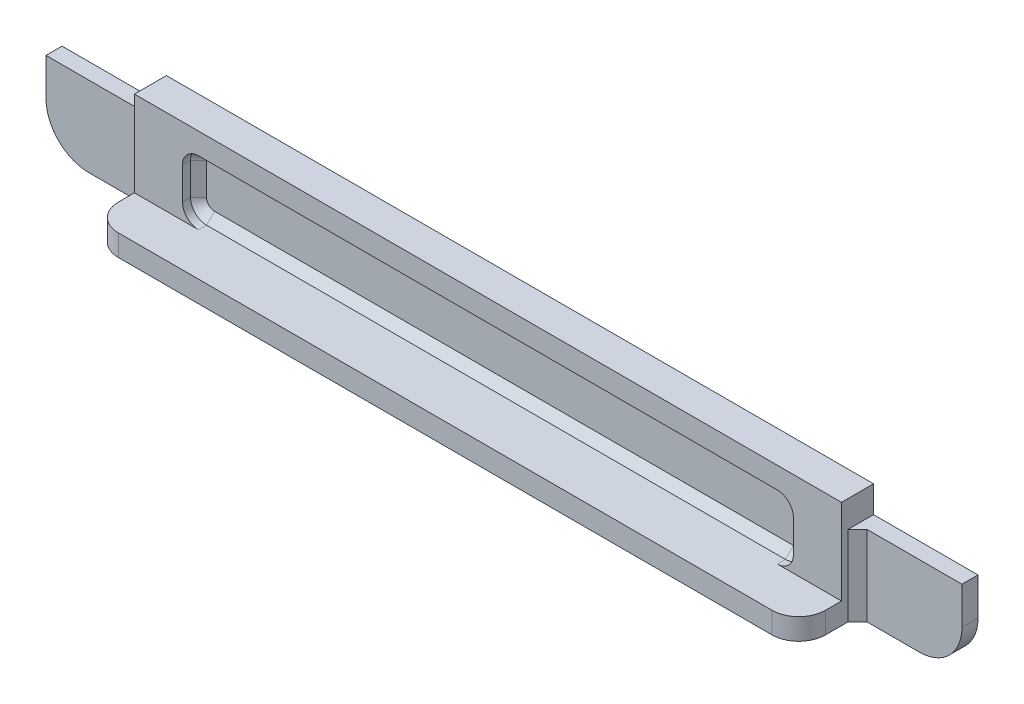
ISO-10303-21;
HEADER;
FILE_DESCRIPTION(('STEP AP214'),'2;1');
FILE_NAME('part.step','',(''),(''),'','','');
FILE_SCHEMA(('AUTOMOTIVE_DESIGN { 1 0 10303 214 1 1 1 1 }'));
ENDSEC;
DATA;
#1=APPLICATION_CONTEXT('core data for automotive mechanical design processes');
#2=APPLICATION_PROTOCOL_DEFINITION('international standard','automotive_design',2000,#1);
#3=PRODUCT_CONTEXT('',#1,'mechanical');
#4=PRODUCT('Part','Part','',(#3));
#5=PRODUCT_RELATED_PRODUCT_CATEGORY('part','',(#4));
#6=PRODUCT_DEFINITION_FORMATION('','',#4);
#7=PRODUCT_DEFINITION_CONTEXT('part definition',#1,'design');
#8=PRODUCT_DEFINITION('design','',#6,#7);
#9=PRODUCT_DEFINITION_SHAPE('','',#8);
#10=(LENGTH_UNIT() NAMED_UNIT(*) SI_UNIT(.MILLI.,.METRE.));
#11=(NAMED_UNIT(*) PLANE_ANGLE_UNIT() SI_UNIT($,.RADIAN.));
#12=(NAMED_UNIT(*) SI_UNIT($,.STERADIAN.) SOLID_ANGLE_UNIT());
#13=UNCERTAINTY_MEASURE_WITH_UNIT(LENGTH_MEASURE(1.E-05),#10,'distance_accuracy_value','');
#14=(GEOMETRIC_REPRESENTATION_CONTEXT(3) GLOBAL_UNCERTAINTY_ASSIGNED_CONTEXT((#13)) GLOBAL_UNIT_ASSIGNED_CONTEXT((#10,
#11,#12)) REPRESENTATION_CONTEXT('',''));
#15=CARTESIAN_POINT('',(0.,0.,0.));
#16=DIRECTION('',(0.,0.,1.));
#17=DIRECTION('',(1.,0.,0.));
#18=AXIS2_PLACEMENT_3D('',#15,#16,#17);
#19=CARTESIAN_POINT('',(85.725,10.,6.));
#20=DIRECTION('',(-1.,0.,0.));
#21=DIRECTION('',(0.,0.,1.));
#22=AXIS2_PLACEMENT_3D('',#19,#20,#21);
#23=PLANE('',#22);
#24=DIRECTION('',(0.,1.,0.));
#25=VECTOR('',#24,1.);
#26=CARTESIAN_POINT('',(85.725,-10.,3.));
#27=LINE('',#26,#25);
#28=CARTESIAN_POINT('',(85.725,-2.,3.));
#29=VERTEX_POINT('',#28);
#30=CARTESIAN_POINT('',(85.725,5.,3.));
#31=VERTEX_POINT('',#30);
#32=EDGE_CURVE('E328',#29,#31,#27,.T.);
#33=ORIENTED_EDGE('',*,*,#32,.F.);
#34=DIRECTION('',(0.,0.,-1.));
#35=VECTOR('',#34,1.);
#36=CARTESIAN_POINT('',(85.725,-2.,6.));
#37=LINE('',#36,#35);
#38=CARTESIAN_POINT('',(85.725,-2.,0.));
#39=VERTEX_POINT('',#38);
#40=EDGE_CURVE('E418',#29,#39,#37,.T.);
#41=ORIENTED_EDGE('',*,*,#40,.T.);
#42=DIRECTION('',(0.,1.,0.));
#43=VECTOR('',#42,1.);
#44=CARTESIAN_POINT('',(85.725,10.,0.));
#45=LINE('',#44,#43);
#46=CARTESIAN_POINT('',(85.725,5.,0.));
#47=VERTEX_POINT('',#46);
#48=EDGE_CURVE('E351',#39,#47,#45,.T.);
#49=ORIENTED_EDGE('',*,*,#48,.T.);
#50=DIRECTION('',(0.,0.,1.));
#51=VECTOR('',#50,1.);
#52=CARTESIAN_POINT('',(85.725,5.,-7.));
#53=LINE('',#52,#51);
#54=EDGE_CURVE('E300',#47,#31,#53,.T.);
#55=ORIENTED_EDGE('',*,*,#54,.T.);
#56=EDGE_LOOP('',(#33,#41,#49,#55));
#57=FACE_BOUND('',#56,.T.);
#58=ADVANCED_FACE('F33',(#57),#23,.F.);
#59=CARTESIAN_POINT('',(-85.725,10.,6.));
#60=DIRECTION('',(0.,-1.,0.));
#61=DIRECTION('',(0.,0.,-1.));
#62=AXIS2_PLACEMENT_3D('',#59,#60,#61);
#63=PLANE('',#62);
#64=DIRECTION('',(-1.,0.,0.));
#65=VECTOR('',#64,1.);
#66=CARTESIAN_POINT('',(-85.725,10.,6.));
#67=LINE('',#66,#65);
#68=CARTESIAN_POINT('',(66.175,10.,6.));
#69=VERTEX_POINT('',#68);
#70=CARTESIAN_POINT('',(-66.175,10.,6.));
#71=VERTEX_POINT('',#70);
#72=EDGE_CURVE('E352',#69,#71,#67,.T.);
#73=ORIENTED_EDGE('',*,*,#72,.F.);
#74=DIRECTION('',(0.,0.,1.));
#75=VECTOR('',#74,1.);
#76=CARTESIAN_POINT('',(66.175,10.,-7.));
#77=LINE('',#76,#75);
#78=CARTESIAN_POINT('',(66.175,10.,0.));
#79=VERTEX_POINT('',#78);
#80=EDGE_CURVE('E299',#79,#69,#77,.T.);
#81=ORIENTED_EDGE('',*,*,#80,.F.);
#82=DIRECTION('',(-1.,0.,0.));
#83=VECTOR('',#82,1.);
#84=CARTESIAN_POINT('',(-85.725,10.,0.));
#85=LINE('',#84,#83);
#86=CARTESIAN_POINT('',(-66.175,10.,0.));
#87=VERTEX_POINT('',#86);
#88=EDGE_CURVE('E358',#79,#87,#85,.T.);
#89=ORIENTED_EDGE('',*,*,#88,.T.);
#90=DIRECTION('',(0.,0.,1.));
#91=VECTOR('',#90,1.);
#92=CARTESIAN_POINT('',(-66.175,10.,-7.));
#93=LINE('',#92,#91);
#94=EDGE_CURVE('E314',#87,#71,#93,.T.);
#95=ORIENTED_EDGE('',*,*,#94,.T.);
#96=EDGE_LOOP('',(#73,#81,#89,#95));
#97=FACE_BOUND('',#96,.T.);
#98=ADVANCED_FACE('F596',(#97),#63,.F.);
#99=CARTESIAN_POINT('',(-85.725,10.,6.));
#100=DIRECTION('',(1.,0.,0.));
#101=DIRECTION('',(0.,0.,-1.));
#102=AXIS2_PLACEMENT_3D('',#99,#100,#101);
#103=PLANE('',#102);
#104=DIRECTION('',(0.,-1.,0.));
#105=VECTOR('',#104,1.);
#106=CARTESIAN_POINT('',(-85.725,10.,0.));
#107=LINE('',#106,#105);
#108=CARTESIAN_POINT('',(-85.725,5.,0.));
#109=VERTEX_POINT('',#108);
#110=CARTESIAN_POINT('',(-85.725,-2.,0.));
#111=VERTEX_POINT('',#110);
#112=EDGE_CURVE('E360',#109,#111,#107,.T.);
#113=ORIENTED_EDGE('',*,*,#112,.T.);
#114=DIRECTION('',(0.,0.,-1.));
#115=VECTOR('',#114,1.);
#116=CARTESIAN_POINT('',(-85.725,-2.,6.));
#117=LINE('',#116,#115);
#118=CARTESIAN_POINT('',(-85.725,-2.,3.));
#119=VERTEX_POINT('',#118);
#120=EDGE_CURVE('E453',#111,#119,#117,.F.);
#121=ORIENTED_EDGE('',*,*,#120,.T.);
#122=DIRECTION('',(0.,-1.,0.));
#123=VECTOR('',#122,1.);
#124=CARTESIAN_POINT('',(-85.725,-10.,3.));
#125=LINE('',#124,#123);
#126=CARTESIAN_POINT('',(-85.725,5.,3.));
#127=VERTEX_POINT('',#126);
#128=EDGE_CURVE('E341',#127,#119,#125,.T.);
#129=ORIENTED_EDGE('',*,*,#128,.F.);
#130=DIRECTION('',(0.,0.,1.));
#131=VECTOR('',#130,1.);
#132=CARTESIAN_POINT('',(-85.725,5.,-7.));
#133=LINE('',#132,#131);
#134=EDGE_CURVE('E313',#109,#127,#133,.T.);
#135=ORIENTED_EDGE('',*,*,#134,.F.);
#136=EDGE_LOOP('',(#113,#121,#129,#135));
#137=FACE_BOUND('',#136,.T.);
#138=ADVANCED_FACE('F563',(#137),#103,.F.);
#139=CARTESIAN_POINT('',(-85.725,-10.,6.));
#140=DIRECTION('',(0.,1.,0.));
#141=DIRECTION('',(0.,0.,1.));
#142=AXIS2_PLACEMENT_3D('',#139,#140,#141);
#143=PLANE('',#142);
#144=DIRECTION('',(0.,0.,1.));
#145=VECTOR('',#144,1.);
#146=CARTESIAN_POINT('',(66.175,-10.,3.));
#147=LINE('',#146,#145);
#148=CARTESIAN_POINT('',(66.175,-10.,4.80000000000001));
#149=VERTEX_POINT('',#148);
#150=CARTESIAN_POINT('',(66.175,-10.,9.));
#151=VERTEX_POINT('',#150);
#152=EDGE_CURVE('E336',#149,#151,#147,.T.);
#153=ORIENTED_EDGE('',*,*,#152,.T.);
#154=CARTESIAN_POINT('',(61.175,-10.,9.));
#155=DIRECTION('',(0.,1.,0.));
#156=DIRECTION('',(0.,0.,1.));
#157=AXIS2_PLACEMENT_3D('',#154,#155,#156);
#158=CIRCLE('',#157,5.);
#159=CARTESIAN_POINT('',(61.175,-10.,14.));
#160=VERTEX_POINT('',#159);
#161=EDGE_CURVE('E41',#151,#160,#158,.F.);
#162=ORIENTED_EDGE('',*,*,#161,.T.);
#163=DIRECTION('',(1.,0.,0.));
#164=VECTOR('',#163,1.);
#165=CARTESIAN_POINT('',(-66.175,-10.,14.));
#166=LINE('',#165,#164);
#167=CARTESIAN_POINT('',(-61.175,-10.,14.));
#168=VERTEX_POINT('',#167);
#169=EDGE_CURVE('E287',#168,#160,#166,.T.);
#170=ORIENTED_EDGE('',*,*,#169,.F.);
#171=CARTESIAN_POINT('',(-61.175,-10.,9.));
#172=DIRECTION('',(0.,1.,0.));
#173=DIRECTION('',(0.,0.,1.));
#174=AXIS2_PLACEMENT_3D('',#171,#172,#173);
#175=CIRCLE('',#174,5.);
#176=CARTESIAN_POINT('',(-66.175,-10.,9.));
#177=VERTEX_POINT('',#176);
#178=EDGE_CURVE('E48',#168,#177,#175,.F.);
#179=ORIENTED_EDGE('',*,*,#178,.T.);
#180=DIRECTION('',(0.,0.,1.));
#181=VECTOR('',#180,1.);
#182=CARTESIAN_POINT('',(-66.175,-10.,3.));
#183=LINE('',#182,#181);
#184=CARTESIAN_POINT('',(-66.175,-10.,4.80000000000001));
#185=VERTEX_POINT('',#184);
#186=EDGE_CURVE('E348',#185,#177,#183,.T.);
#187=ORIENTED_EDGE('',*,*,#186,.F.);
#188=DIRECTION('',(0.70710678118655,0.,0.707106781186545));
#189=VECTOR('',#188,1.);
#190=CARTESIAN_POINT('',(-75.3500000000001,-10.,-4.375));
#191=LINE('',#190,#189);
#192=CARTESIAN_POINT('',(-67.975,-10.,3.));
#193=VERTEX_POINT('',#192);
#194=EDGE_CURVE('E382',#185,#193,#191,.F.);
#195=ORIENTED_EDGE('',*,*,#194,.T.);
#196=DIRECTION('',(1.,0.,0.));
#197=VECTOR('',#196,1.);
#198=CARTESIAN_POINT('',(-85.725,-10.,3.));
#199=LINE('',#198,#197);
#200=CARTESIAN_POINT('',(-77.725,-10.,3.));
#201=VERTEX_POINT('',#200);
#202=EDGE_CURVE('E344',#201,#193,#199,.T.);
#203=ORIENTED_EDGE('',*,*,#202,.F.);
#204=DIRECTION('',(0.,0.,-1.));
#205=VECTOR('',#204,1.);
#206=CARTESIAN_POINT('',(-77.725,-10.,6.));
#207=LINE('',#206,#205);
#208=CARTESIAN_POINT('',(-77.725,-10.,0.));
#209=VERTEX_POINT('',#208);
#210=EDGE_CURVE('E446',#201,#209,#207,.T.);
#211=ORIENTED_EDGE('',*,*,#210,.T.);
#212=DIRECTION('',(1.,0.,0.));
#213=VECTOR('',#212,1.);
#214=CARTESIAN_POINT('',(-85.725,-10.,0.));
#215=LINE('',#214,#213);
#216=CARTESIAN_POINT('',(77.725,-10.,0.));
#217=VERTEX_POINT('',#216);
#218=EDGE_CURVE('E356',#209,#217,#215,.T.);
#219=ORIENTED_EDGE('',*,*,#218,.T.);
#220=DIRECTION('',(0.,0.,-1.));
#221=VECTOR('',#220,1.);
#222=CARTESIAN_POINT('',(77.725,-10.,6.));
#223=LINE('',#222,#221);
#224=CARTESIAN_POINT('',(77.725,-10.,3.));
#225=VERTEX_POINT('',#224);
#226=EDGE_CURVE('E449',#217,#225,#223,.F.);
#227=ORIENTED_EDGE('',*,*,#226,.T.);
#228=DIRECTION('',(1.,0.,0.));
#229=VECTOR('',#228,1.);
#230=CARTESIAN_POINT('',(85.725,-10.,3.));
#231=LINE('',#230,#229);
#232=CARTESIAN_POINT('',(67.975,-10.,3.));
#233=VERTEX_POINT('',#232);
#234=EDGE_CURVE('E333',#233,#225,#231,.T.);
#235=ORIENTED_EDGE('',*,*,#234,.F.);
#236=DIRECTION('',(-0.70710678118655,0.,0.707106781186545));
#237=VECTOR('',#236,1.);
#238=CARTESIAN_POINT('',(-10.3750000000006,-10.,81.35));
#239=LINE('',#238,#237);
#240=EDGE_CURVE('E375',#233,#149,#239,.T.);
#241=ORIENTED_EDGE('',*,*,#240,.T.);
#242=EDGE_LOOP('',(#153,#162,#170,#179,#187,#195,#203,#211,#219,#227,#235,#241));
#243=FACE_BOUND('',#242,.T.);
#244=ADVANCED_FACE('F469',(#243),#143,.F.);
#245=CARTESIAN_POINT('',(0.,0.,6.));
#246=DIRECTION('',(0.,0.,1.));
#247=DIRECTION('',(1.,0.,0.));
#248=AXIS2_PLACEMENT_3D('',#245,#246,#247);
#249=PLANE('',#248);
#250=CARTESIAN_POINT('',(54.175,-3.,6.));
#251=DIRECTION('',(0.,0.,1.));
#252=DIRECTION('',(1.,0.,0.));
#253=AXIS2_PLACEMENT_3D('',#250,#251,#252);
#254=CIRCLE('',#253,3.);
#255=CARTESIAN_POINT('',(54.175,-6.,6.));
#256=VERTEX_POINT('',#255);
#257=CARTESIAN_POINT('',(57.175,-2.99999999999998,6.));
#258=VERTEX_POINT('',#257);
#259=EDGE_CURVE('E247',#256,#258,#254,.T.);
#260=ORIENTED_EDGE('',*,*,#259,.F.);
#261=DIRECTION('',(-1.,0.,0.));
#262=VECTOR('',#261,1.);
#263=CARTESIAN_POINT('',(-66.175,-6.,6.));
#264=LINE('',#263,#262);
#265=CARTESIAN_POINT('',(66.175,-6.,6.));
#266=VERTEX_POINT('',#265);
#267=EDGE_CURVE('E291',#266,#256,#264,.T.);
#268=ORIENTED_EDGE('',*,*,#267,.F.);
#269=DIRECTION('',(0.,-1.,0.));
#270=VECTOR('',#269,1.);
#271=CARTESIAN_POINT('',(66.175,-10.,6.));
#272=LINE('',#271,#270);
#273=EDGE_CURVE('E327',#69,#266,#272,.T.);
#274=ORIENTED_EDGE('',*,*,#273,.F.);
#275=ORIENTED_EDGE('',*,*,#72,.T.);
#276=DIRECTION('',(0.,1.,0.));
#277=VECTOR('',#276,1.);
#278=CARTESIAN_POINT('',(-66.175,-10.,6.));
#279=LINE('',#278,#277);
#280=CARTESIAN_POINT('',(-66.175,-6.,6.));
#281=VERTEX_POINT('',#280);
#282=EDGE_CURVE('E340',#281,#71,#279,.T.);
#283=ORIENTED_EDGE('',*,*,#282,.F.);
#284=CARTESIAN_POINT('',(-54.175,-6.,6.));
#285=VERTEX_POINT('',#284);
#286=EDGE_CURVE('E275',#285,#281,#264,.T.);
#287=ORIENTED_EDGE('',*,*,#286,.F.);
#288=CARTESIAN_POINT('',(-54.175,-3.,6.));
#289=DIRECTION('',(0.,0.,1.));
#290=DIRECTION('',(-1.,0.,0.));
#291=AXIS2_PLACEMENT_3D('',#288,#289,#290);
#292=CIRCLE('',#291,3.);
#293=CARTESIAN_POINT('',(-57.175,-3.,6.));
#294=VERTEX_POINT('',#293);
#295=EDGE_CURVE('E244',#294,#285,#292,.T.);
#296=ORIENTED_EDGE('',*,*,#295,.F.);
#297=DIRECTION('',(0.,-1.,0.));
#298=VECTOR('',#297,1.);
#299=CARTESIAN_POINT('',(-57.175,-2.99999999999998,6.));
#300=LINE('',#299,#298);
#301=CARTESIAN_POINT('',(-57.175,2.99999999999998,6.));
#302=VERTEX_POINT('',#301);
#303=EDGE_CURVE('E269',#302,#294,#300,.T.);
#304=ORIENTED_EDGE('',*,*,#303,.F.);
#305=CARTESIAN_POINT('',(-54.175,3.,6.));
#306=DIRECTION('',(0.,0.,1.));
#307=DIRECTION('',(-1.,0.,0.));
#308=AXIS2_PLACEMENT_3D('',#305,#306,#307);
#309=CIRCLE('',#308,3.);
#310=CARTESIAN_POINT('',(-54.175,6.,6.));
#311=VERTEX_POINT('',#310);
#312=EDGE_CURVE('E266',#311,#302,#309,.T.);
#313=ORIENTED_EDGE('',*,*,#312,.F.);
#314=DIRECTION('',(-1.,0.,0.));
#315=VECTOR('',#314,1.);
#316=CARTESIAN_POINT('',(-54.175,6.,6.));
#317=LINE('',#316,#315);
#318=CARTESIAN_POINT('',(54.175,6.,6.));
#319=VERTEX_POINT('',#318);
#320=EDGE_CURVE('E261',#319,#311,#317,.T.);
#321=ORIENTED_EDGE('',*,*,#320,.F.);
#322=CARTESIAN_POINT('',(54.175,3.,6.));
#323=DIRECTION('',(0.,0.,1.));
#324=DIRECTION('',(-1.,0.,0.));
#325=AXIS2_PLACEMENT_3D('',#322,#323,#324);
#326=CIRCLE('',#325,3.);
#327=CARTESIAN_POINT('',(57.175,2.99999999999998,6.));
#328=VERTEX_POINT('',#327);
#329=EDGE_CURVE('E259',#328,#319,#326,.T.);
#330=ORIENTED_EDGE('',*,*,#329,.F.);
#331=DIRECTION('',(0.,1.,0.));
#332=VECTOR('',#331,1.);
#333=CARTESIAN_POINT('',(57.175,-2.99999999999998,6.));
#334=LINE('',#333,#332);
#335=EDGE_CURVE('E237',#258,#328,#334,.T.);
#336=ORIENTED_EDGE('',*,*,#335,.F.);
#337=EDGE_LOOP('',(#260,#268,#274,#275,#283,#287,#296,#304,#313,#321,#330,#336));
#338=FACE_BOUND('',#337,.T.);
#339=ADVANCED_FACE('F256',(#338),#249,.T.);
#340=CARTESIAN_POINT('',(0.,0.,0.));
#341=DIRECTION('',(0.,0.,1.));
#342=DIRECTION('',(1.,0.,0.));
#343=AXIS2_PLACEMENT_3D('',#340,#341,#342);
#344=PLANE('',#343);
#345=ORIENTED_EDGE('',*,*,#48,.F.);
#346=CARTESIAN_POINT('',(77.725,-2.,0.));
#347=DIRECTION('',(0.,0.,1.));
#348=DIRECTION('',(1.,0.,0.));
#349=AXIS2_PLACEMENT_3D('',#346,#347,#348);
#350=CIRCLE('',#349,8.);
#351=EDGE_CURVE('E444',#39,#217,#350,.F.);
#352=ORIENTED_EDGE('',*,*,#351,.T.);
#353=ORIENTED_EDGE('',*,*,#218,.F.);
#354=CARTESIAN_POINT('',(-77.725,-2.,0.));
#355=DIRECTION('',(0.,0.,1.));
#356=DIRECTION('',(1.,0.,0.));
#357=AXIS2_PLACEMENT_3D('',#354,#355,#356);
#358=CIRCLE('',#357,8.);
#359=EDGE_CURVE('E442',#209,#111,#358,.F.);
#360=ORIENTED_EDGE('',*,*,#359,.T.);
#361=ORIENTED_EDGE('',*,*,#112,.F.);
#362=DIRECTION('',(1.,0.,0.));
#363=VECTOR('',#362,1.);
#364=CARTESIAN_POINT('',(0.,5.,0.));
#365=LINE('',#364,#363);
#366=CARTESIAN_POINT('',(-66.175,5.,0.));
#367=VERTEX_POINT('',#366);
#368=EDGE_CURVE('E317',#109,#367,#365,.T.);
#369=ORIENTED_EDGE('',*,*,#368,.T.);
#370=DIRECTION('',(0.,1.,0.));
#371=VECTOR('',#370,1.);
#372=CARTESIAN_POINT('',(-66.175,0.,0.));
#373=LINE('',#372,#371);
#374=EDGE_CURVE('E324',#367,#87,#373,.T.);
#375=ORIENTED_EDGE('',*,*,#374,.T.);
#376=ORIENTED_EDGE('',*,*,#88,.F.);
#377=DIRECTION('',(0.,-1.,0.));
#378=VECTOR('',#377,1.);
#379=CARTESIAN_POINT('',(66.175,0.,0.));
#380=LINE('',#379,#378);
#381=CARTESIAN_POINT('',(66.175,5.,0.));
#382=VERTEX_POINT('',#381);
#383=EDGE_CURVE('E310',#79,#382,#380,.T.);
#384=ORIENTED_EDGE('',*,*,#383,.T.);
#385=DIRECTION('',(1.,0.,0.));
#386=VECTOR('',#385,1.);
#387=CARTESIAN_POINT('',(0.,5.,0.));
#388=LINE('',#387,#386);
#389=EDGE_CURVE('E303',#382,#47,#388,.T.);
#390=ORIENTED_EDGE('',*,*,#389,.T.);
#391=EDGE_LOOP('',(#345,#352,#353,#360,#361,#369,#375,#376,#384,#390));
#392=FACE_BOUND('',#391,.T.);
#393=ADVANCED_FACE('F573',(#392),#344,.F.);
#394=CARTESIAN_POINT('',(-66.175,-10.,3.));
#395=DIRECTION('',(1.,0.,0.));
#396=DIRECTION('',(0.,0.,-1.));
#397=AXIS2_PLACEMENT_3D('',#394,#395,#396);
#398=PLANE('',#397);
#399=ORIENTED_EDGE('',*,*,#186,.T.);
#400=DIRECTION('',(0.,-1.,0.));
#401=VECTOR('',#400,1.);
#402=CARTESIAN_POINT('',(-66.175,-10.,9.));
#403=LINE('',#402,#401);
#404=CARTESIAN_POINT('',(-66.175,-6.,9.));
#405=VERTEX_POINT('',#404);
#406=EDGE_CURVE('E11',#177,#405,#403,.F.);
#407=ORIENTED_EDGE('',*,*,#406,.T.);
#408=DIRECTION('',(0.,0.,-1.));
#409=VECTOR('',#408,1.);
#410=CARTESIAN_POINT('',(-66.175,-6.,14.));
#411=LINE('',#410,#409);
#412=EDGE_CURVE('E294',#405,#281,#411,.T.);
#413=ORIENTED_EDGE('',*,*,#412,.T.);
#414=ORIENTED_EDGE('',*,*,#282,.T.);
#415=ORIENTED_EDGE('',*,*,#94,.F.);
#416=ORIENTED_EDGE('',*,*,#374,.F.);
#417=DIRECTION('',(0.,0.,1.));
#418=VECTOR('',#417,1.);
#419=CARTESIAN_POINT('',(-66.175,5.,-7.));
#420=LINE('',#419,#418);
#421=CARTESIAN_POINT('',(-66.175,5.,4.80000000000001));
#422=VERTEX_POINT('',#421);
#423=EDGE_CURVE('E318',#367,#422,#420,.T.);
#424=ORIENTED_EDGE('',*,*,#423,.T.);
#425=DIRECTION('',(0.,-1.,0.));
#426=VECTOR('',#425,1.);
#427=CARTESIAN_POINT('',(-66.175,-10.,4.80000000000001));
#428=LINE('',#427,#426);
#429=EDGE_CURVE('E373',#422,#185,#428,.T.);
#430=ORIENTED_EDGE('',*,*,#429,.T.);
#431=EDGE_LOOP('',(#399,#407,#413,#414,#415,#416,#424,#430));
#432=FACE_BOUND('',#431,.T.);
#433=ADVANCED_FACE('F546',(#432),#398,.F.);
#434=CARTESIAN_POINT('',(0.,0.,3.));
#435=DIRECTION('',(0.,0.,-1.));
#436=DIRECTION('',(-1.,0.,0.));
#437=AXIS2_PLACEMENT_3D('',#434,#435,#436);
#438=PLANE('',#437);
#439=ORIENTED_EDGE('',*,*,#128,.T.);
#440=CARTESIAN_POINT('',(-77.725,-2.,3.));
#441=DIRECTION('',(0.,0.,-1.));
#442=DIRECTION('',(-1.,0.,0.));
#443=AXIS2_PLACEMENT_3D('',#440,#441,#442);
#444=CIRCLE('',#443,8.);
#445=EDGE_CURVE('E455',#119,#201,#444,.F.);
#446=ORIENTED_EDGE('',*,*,#445,.T.);
#447=ORIENTED_EDGE('',*,*,#202,.T.);
#448=DIRECTION('',(0.,1.,0.));
#449=VECTOR('',#448,1.);
#450=CARTESIAN_POINT('',(-67.975,5.,3.));
#451=LINE('',#450,#449);
#452=CARTESIAN_POINT('',(-67.975,5.,3.));
#453=VERTEX_POINT('',#452);
#454=EDGE_CURVE('E370',#193,#453,#451,.T.);
#455=ORIENTED_EDGE('',*,*,#454,.T.);
#456=DIRECTION('',(-1.,0.,0.));
#457=VECTOR('',#456,1.);
#458=CARTESIAN_POINT('',(-85.725,5.,3.));
#459=LINE('',#458,#457);
#460=EDGE_CURVE('E346',#453,#127,#459,.T.);
#461=ORIENTED_EDGE('',*,*,#460,.T.);
#462=EDGE_LOOP('',(#439,#446,#447,#455,#461));
#463=FACE_BOUND('',#462,.T.);
#464=ADVANCED_FACE('F555',(#463),#438,.F.);
#465=CARTESIAN_POINT('',(66.175,-10.,3.));
#466=DIRECTION('',(-1.,0.,0.));
#467=DIRECTION('',(0.,0.,1.));
#468=AXIS2_PLACEMENT_3D('',#465,#466,#467);
#469=PLANE('',#468);
#470=DIRECTION('',(0.,0.,-1.));
#471=VECTOR('',#470,1.);
#472=CARTESIAN_POINT('',(66.175,-6.,14.));
#473=LINE('',#472,#471);
#474=CARTESIAN_POINT('',(66.175,-6.,9.));
#475=VERTEX_POINT('',#474);
#476=EDGE_CURVE('E297',#475,#266,#473,.T.);
#477=ORIENTED_EDGE('',*,*,#476,.F.);
#478=DIRECTION('',(0.,1.,0.));
#479=VECTOR('',#478,1.);
#480=CARTESIAN_POINT('',(66.175,-10.,9.));
#481=LINE('',#480,#479);
#482=EDGE_CURVE('E56',#475,#151,#481,.F.);
#483=ORIENTED_EDGE('',*,*,#482,.T.);
#484=ORIENTED_EDGE('',*,*,#152,.F.);
#485=DIRECTION('',(0.,1.,0.));
#486=VECTOR('',#485,1.);
#487=CARTESIAN_POINT('',(66.175,-10.,4.80000000000001));
#488=LINE('',#487,#486);
#489=CARTESIAN_POINT('',(66.175,5.,4.80000000000001));
#490=VERTEX_POINT('',#489);
#491=EDGE_CURVE('E367',#149,#490,#488,.T.);
#492=ORIENTED_EDGE('',*,*,#491,.T.);
#493=DIRECTION('',(0.,0.,1.));
#494=VECTOR('',#493,1.);
#495=CARTESIAN_POINT('',(66.175,5.,-7.));
#496=LINE('',#495,#494);
#497=EDGE_CURVE('E304',#382,#490,#496,.T.);
#498=ORIENTED_EDGE('',*,*,#497,.F.);
#499=ORIENTED_EDGE('',*,*,#383,.F.);
#500=ORIENTED_EDGE('',*,*,#80,.T.);
#501=ORIENTED_EDGE('',*,*,#273,.T.);
#502=EDGE_LOOP('',(#477,#483,#484,#492,#498,#499,#500,#501));
#503=FACE_BOUND('',#502,.T.);
#504=ADVANCED_FACE('F479',(#503),#469,.F.);
#505=CARTESIAN_POINT('',(0.,0.,3.));
#506=DIRECTION('',(0.,0.,1.));
#507=DIRECTION('',(1.,0.,0.));
#508=AXIS2_PLACEMENT_3D('',#505,#506,#507);
#509=PLANE('',#508);
#510=ORIENTED_EDGE('',*,*,#234,.T.);
#511=CARTESIAN_POINT('',(77.725,-2.,3.));
#512=DIRECTION('',(0.,0.,1.));
#513=DIRECTION('',(1.,0.,0.));
#514=AXIS2_PLACEMENT_3D('',#511,#512,#513);
#515=CIRCLE('',#514,8.);
#516=EDGE_CURVE('E451',#225,#29,#515,.T.);
#517=ORIENTED_EDGE('',*,*,#516,.T.);
#518=ORIENTED_EDGE('',*,*,#32,.T.);
#519=DIRECTION('',(-1.,0.,0.));
#520=VECTOR('',#519,1.);
#521=CARTESIAN_POINT('',(85.725,5.,3.));
#522=LINE('',#521,#520);
#523=CARTESIAN_POINT('',(67.975,5.,3.));
#524=VERTEX_POINT('',#523);
#525=EDGE_CURVE('E330',#31,#524,#522,.T.);
#526=ORIENTED_EDGE('',*,*,#525,.T.);
#527=DIRECTION('',(0.,-1.,0.));
#528=VECTOR('',#527,1.);
#529=CARTESIAN_POINT('',(67.975,0.,3.));
#530=LINE('',#529,#528);
#531=EDGE_CURVE('E355',#524,#233,#530,.T.);
#532=ORIENTED_EDGE('',*,*,#531,.T.);
#533=EDGE_LOOP('',(#510,#517,#518,#526,#532));
#534=FACE_BOUND('',#533,.T.);
#535=ADVANCED_FACE('F583',(#534),#509,.T.);
#536=CARTESIAN_POINT('',(-85.725,5.,-7.));
#537=DIRECTION('',(0.,-1.,0.));
#538=DIRECTION('',(0.,0.,-1.));
#539=AXIS2_PLACEMENT_3D('',#536,#537,#538);
#540=PLANE('',#539);
#541=ORIENTED_EDGE('',*,*,#134,.T.);
#542=ORIENTED_EDGE('',*,*,#460,.F.);
#543=DIRECTION('',(-0.70710678118655,0.,-0.707106781186545));
#544=VECTOR('',#543,1.);
#545=CARTESIAN_POINT('',(-81.8500000000001,5.,-10.8749999999999));
#546=LINE('',#545,#544);
#547=EDGE_CURVE('E379',#453,#422,#546,.F.);
#548=ORIENTED_EDGE('',*,*,#547,.T.);
#549=ORIENTED_EDGE('',*,*,#423,.F.);
#550=ORIENTED_EDGE('',*,*,#368,.F.);
#551=EDGE_LOOP('',(#541,#542,#548,#549,#550));
#552=FACE_BOUND('',#551,.T.);
#553=ADVANCED_FACE('F557',(#552),#540,.F.);
#554=CARTESIAN_POINT('',(85.725,5.,-7.));
#555=DIRECTION('',(0.,-1.,0.));
#556=DIRECTION('',(0.,0.,-1.));
#557=AXIS2_PLACEMENT_3D('',#554,#555,#556);
#558=PLANE('',#557);
#559=ORIENTED_EDGE('',*,*,#497,.T.);
#560=DIRECTION('',(0.70710678118655,0.,-0.707106781186545));
#561=VECTOR('',#560,1.);
#562=CARTESIAN_POINT('',(81.8500000000001,5.,-10.8749999999999));
#563=LINE('',#562,#561);
#564=EDGE_CURVE('E377',#490,#524,#563,.T.);
#565=ORIENTED_EDGE('',*,*,#564,.T.);
#566=ORIENTED_EDGE('',*,*,#525,.F.);
#567=ORIENTED_EDGE('',*,*,#54,.F.);
#568=ORIENTED_EDGE('',*,*,#389,.F.);
#569=EDGE_LOOP('',(#559,#565,#566,#567,#568));
#570=FACE_BOUND('',#569,.T.);
#571=ADVANCED_FACE('F586',(#570),#558,.F.);
#572=CARTESIAN_POINT('',(67.975,0.,3.));
#573=DIRECTION('',(-0.707106781186545,0.,-0.70710678118655));
#574=DIRECTION('',(0.,-1.,0.));
#575=AXIS2_PLACEMENT_3D('',#572,#573,#574);
#576=PLANE('',#575);
#577=ORIENTED_EDGE('',*,*,#564,.F.);
#578=ORIENTED_EDGE('',*,*,#491,.F.);
#579=ORIENTED_EDGE('',*,*,#240,.F.);
#580=ORIENTED_EDGE('',*,*,#531,.F.);
#581=EDGE_LOOP('',(#577,#578,#579,#580));
#582=FACE_BOUND('',#581,.T.);
#583=ADVANCED_FACE('F591',(#582),#576,.F.);
#584=CARTESIAN_POINT('',(-67.975,0.,3.));
#585=DIRECTION('',(-0.707106781186545,0.,0.70710678118655));
#586=DIRECTION('',(0.,-1.,0.));
#587=AXIS2_PLACEMENT_3D('',#584,#585,#586);
#588=PLANE('',#587);
#589=ORIENTED_EDGE('',*,*,#194,.F.);
#590=ORIENTED_EDGE('',*,*,#429,.F.);
#591=ORIENTED_EDGE('',*,*,#547,.F.);
#592=ORIENTED_EDGE('',*,*,#454,.F.);
#593=EDGE_LOOP('',(#589,#590,#591,#592));
#594=FACE_BOUND('',#593,.T.);
#595=ADVANCED_FACE('F552',(#594),#588,.T.);
#596=CARTESIAN_POINT('',(-66.175,-6.,14.));
#597=DIRECTION('',(0.,-1.,0.));
#598=DIRECTION('',(0.,0.,-1.));
#599=AXIS2_PLACEMENT_3D('',#596,#597,#598);
#600=PLANE('',#599);
#601=DIRECTION('',(-1.,0.,0.));
#602=VECTOR('',#601,1.);
#603=CARTESIAN_POINT('',(-66.175,-6.,14.));
#604=LINE('',#603,#602);
#605=CARTESIAN_POINT('',(61.175,-6.,14.));
#606=VERTEX_POINT('',#605);
#607=CARTESIAN_POINT('',(-61.175,-6.,14.));
#608=VERTEX_POINT('',#607);
#609=EDGE_CURVE('E290',#606,#608,#604,.T.);
#610=ORIENTED_EDGE('',*,*,#609,.F.);
#611=CARTESIAN_POINT('',(61.175,-6.,9.));
#612=DIRECTION('',(0.,-1.,0.));
#613=DIRECTION('',(0.,0.,-1.));
#614=AXIS2_PLACEMENT_3D('',#611,#612,#613);
#615=CIRCLE('',#614,5.);
#616=EDGE_CURVE('E465',#606,#475,#615,.F.);
#617=ORIENTED_EDGE('',*,*,#616,.T.);
#618=ORIENTED_EDGE('',*,*,#476,.T.);
#619=ORIENTED_EDGE('',*,*,#267,.T.);
#620=DIRECTION('',(0.,0.,1.));
#621=VECTOR('',#620,1.);
#622=CARTESIAN_POINT('',(54.175,-6.,3.));
#623=LINE('',#622,#621);
#624=CARTESIAN_POINT('',(54.175,-6.,4.49999999999999));
#625=VERTEX_POINT('',#624);
#626=EDGE_CURVE('E250',#625,#256,#623,.T.);
#627=ORIENTED_EDGE('',*,*,#626,.F.);
#628=DIRECTION('',(-1.,0.,0.));
#629=VECTOR('',#628,1.);
#630=CARTESIAN_POINT('',(-66.175,-6.,4.49999999999999));
#631=LINE('',#630,#629);
#632=CARTESIAN_POINT('',(-54.175,-6.,4.49999999999999));
#633=VERTEX_POINT('',#632);
#634=EDGE_CURVE('E402',#625,#633,#631,.T.);
#635=ORIENTED_EDGE('',*,*,#634,.T.);
#636=DIRECTION('',(0.,0.,1.));
#637=VECTOR('',#636,1.);
#638=CARTESIAN_POINT('',(-54.175,-6.,3.));
#639=LINE('',#638,#637);
#640=EDGE_CURVE('E276',#633,#285,#639,.T.);
#641=ORIENTED_EDGE('',*,*,#640,.T.);
#642=ORIENTED_EDGE('',*,*,#286,.T.);
#643=ORIENTED_EDGE('',*,*,#412,.F.);
#644=CARTESIAN_POINT('',(-61.175,-6.,9.));
#645=DIRECTION('',(0.,-1.,0.));
#646=DIRECTION('',(0.,0.,-1.));
#647=AXIS2_PLACEMENT_3D('',#644,#645,#646);
#648=CIRCLE('',#647,5.);
#649=EDGE_CURVE('E463',#405,#608,#648,.F.);
#650=ORIENTED_EDGE('',*,*,#649,.T.);
#651=EDGE_LOOP('',(#610,#617,#618,#619,#627,#635,#641,#642,#643,#650));
#652=FACE_BOUND('',#651,.T.);
#653=ADVANCED_FACE('F478',(#652),#600,.F.);
#654=CARTESIAN_POINT('',(0.,0.,14.));
#655=DIRECTION('',(0.,0.,-1.));
#656=DIRECTION('',(-1.,0.,0.));
#657=AXIS2_PLACEMENT_3D('',#654,#655,#656);
#658=PLANE('',#657);
#659=ORIENTED_EDGE('',*,*,#169,.T.);
#660=DIRECTION('',(0.,1.,0.));
#661=VECTOR('',#660,1.);
#662=CARTESIAN_POINT('',(61.175,0.,14.));
#663=LINE('',#662,#661);
#664=EDGE_CURVE('E460',#160,#606,#663,.T.);
#665=ORIENTED_EDGE('',*,*,#664,.T.);
#666=ORIENTED_EDGE('',*,*,#609,.T.);
#667=DIRECTION('',(0.,-1.,0.));
#668=VECTOR('',#667,1.);
#669=CARTESIAN_POINT('',(-61.175,0.,14.));
#670=LINE('',#669,#668);
#671=EDGE_CURVE('E457',#608,#168,#670,.T.);
#672=ORIENTED_EDGE('',*,*,#671,.T.);
#673=EDGE_LOOP('',(#659,#665,#666,#672));
#674=FACE_BOUND('',#673,.T.);
#675=ADVANCED_FACE('F473',(#674),#658,.F.);
#676=CARTESIAN_POINT('',(54.175,-3.,3.));
#677=DIRECTION('',(0.,0.,1.));
#678=DIRECTION('',(1.,0.,0.));
#679=AXIS2_PLACEMENT_3D('',#676,#677,#678);
#680=CYLINDRICAL_SURFACE('',#679,3.);
#681=DIRECTION('',(0.,0.,1.));
#682=VECTOR('',#681,1.);
#683=CARTESIAN_POINT('',(57.175,-2.99999999999998,3.));
#684=LINE('',#683,#682);
#685=CARTESIAN_POINT('',(57.175,-2.99999999999998,4.49999999999999));
#686=VERTEX_POINT('',#685);
#687=EDGE_CURVE('E232',#686,#258,#684,.T.);
#688=ORIENTED_EDGE('',*,*,#687,.F.);
#689=CARTESIAN_POINT('',(54.175,-3.,4.49999999999999));
#690=DIRECTION('',(0.,0.,1.));
#691=DIRECTION('',(1.,0.,0.));
#692=AXIS2_PLACEMENT_3D('',#689,#690,#691);
#693=CIRCLE('',#692,3.);
#694=EDGE_CURVE('E405',#686,#625,#693,.F.);
#695=ORIENTED_EDGE('',*,*,#694,.T.);
#696=ORIENTED_EDGE('',*,*,#626,.T.);
#697=ORIENTED_EDGE('',*,*,#259,.T.);
#698=EDGE_LOOP('',(#688,#695,#696,#697));
#699=FACE_BOUND('',#698,.T.);
#700=ADVANCED_FACE('F248',(#699),#680,.F.);
#701=CARTESIAN_POINT('',(-54.175,-3.,3.));
#702=DIRECTION('',(0.,0.,1.));
#703=DIRECTION('',(1.,0.,0.));
#704=AXIS2_PLACEMENT_3D('',#701,#702,#703);
#705=CYLINDRICAL_SURFACE('',#704,3.);
#706=ORIENTED_EDGE('',*,*,#640,.F.);
#707=CARTESIAN_POINT('',(-54.175,-3.,4.49999999999999));
#708=DIRECTION('',(0.,0.,1.));
#709=DIRECTION('',(1.,0.,0.));
#710=AXIS2_PLACEMENT_3D('',#707,#708,#709);
#711=CIRCLE('',#710,3.);
#712=CARTESIAN_POINT('',(-57.175,-3.,4.49999999999999));
#713=VERTEX_POINT('',#712);
#714=EDGE_CURVE('E407',#633,#713,#711,.F.);
#715=ORIENTED_EDGE('',*,*,#714,.T.);
#716=DIRECTION('',(0.,0.,1.));
#717=VECTOR('',#716,1.);
#718=CARTESIAN_POINT('',(-57.175,-3.,3.));
#719=LINE('',#718,#717);
#720=EDGE_CURVE('E278',#713,#294,#719,.T.);
#721=ORIENTED_EDGE('',*,*,#720,.T.);
#722=ORIENTED_EDGE('',*,*,#295,.T.);
#723=EDGE_LOOP('',(#706,#715,#721,#722));
#724=FACE_BOUND('',#723,.T.);
#725=ADVANCED_FACE('F505',(#724),#705,.F.);
#726=CARTESIAN_POINT('',(-57.175,-2.99999999999998,3.));
#727=DIRECTION('',(-1.,0.,0.));
#728=DIRECTION('',(0.,-1.,0.));
#729=AXIS2_PLACEMENT_3D('',#726,#727,#728);
#730=PLANE('',#729);
#731=ORIENTED_EDGE('',*,*,#720,.F.);
#732=DIRECTION('',(0.,1.,0.));
#733=VECTOR('',#732,1.);
#734=CARTESIAN_POINT('',(-57.175,-2.99999999999998,4.49999999999999));
#735=LINE('',#734,#733);
#736=CARTESIAN_POINT('',(-57.175,2.99999999999998,4.49999999999999));
#737=VERTEX_POINT('',#736);
#738=EDGE_CURVE('E410',#713,#737,#735,.T.);
#739=ORIENTED_EDGE('',*,*,#738,.T.);
#740=DIRECTION('',(0.,0.,1.));
#741=VECTOR('',#740,1.);
#742=CARTESIAN_POINT('',(-57.175,2.99999999999998,3.));
#743=LINE('',#742,#741);
#744=EDGE_CURVE('E280',#737,#302,#743,.T.);
#745=ORIENTED_EDGE('',*,*,#744,.T.);
#746=ORIENTED_EDGE('',*,*,#303,.T.);
#747=EDGE_LOOP('',(#731,#739,#745,#746));
#748=FACE_BOUND('',#747,.T.);
#749=ADVANCED_FACE('F508',(#748),#730,.F.);
#750=CARTESIAN_POINT('',(-54.175,3.,3.));
#751=DIRECTION('',(0.,0.,1.));
#752=DIRECTION('',(1.,0.,0.));
#753=AXIS2_PLACEMENT_3D('',#750,#751,#752);
#754=CYLINDRICAL_SURFACE('',#753,3.);
#755=ORIENTED_EDGE('',*,*,#744,.F.);
#756=CARTESIAN_POINT('',(-54.175,3.,4.49999999999999));
#757=DIRECTION('',(0.,0.,1.));
#758=DIRECTION('',(1.,0.,0.));
#759=AXIS2_PLACEMENT_3D('',#756,#757,#758);
#760=CIRCLE('',#759,3.);
#761=CARTESIAN_POINT('',(-54.175,6.,4.49999999999999));
#762=VERTEX_POINT('',#761);
#763=EDGE_CURVE('E414',#737,#762,#760,.F.);
#764=ORIENTED_EDGE('',*,*,#763,.T.);
#765=DIRECTION('',(0.,0.,1.));
#766=VECTOR('',#765,1.);
#767=CARTESIAN_POINT('',(-54.175,6.,3.));
#768=LINE('',#767,#766);
#769=EDGE_CURVE('E282',#762,#311,#768,.T.);
#770=ORIENTED_EDGE('',*,*,#769,.T.);
#771=ORIENTED_EDGE('',*,*,#312,.T.);
#772=EDGE_LOOP('',(#755,#764,#770,#771));
#773=FACE_BOUND('',#772,.T.);
#774=ADVANCED_FACE('F522',(#773),#754,.F.);
#775=CARTESIAN_POINT('',(-54.175,6.,3.));
#776=DIRECTION('',(0.,1.,0.));
#777=DIRECTION('',(0.,0.,1.));
#778=AXIS2_PLACEMENT_3D('',#775,#776,#777);
#779=PLANE('',#778);
#780=ORIENTED_EDGE('',*,*,#769,.F.);
#781=DIRECTION('',(1.,0.,0.));
#782=VECTOR('',#781,1.);
#783=CARTESIAN_POINT('',(-54.175,6.,4.49999999999999));
#784=LINE('',#783,#782);
#785=CARTESIAN_POINT('',(54.175,6.,4.49999999999999));
#786=VERTEX_POINT('',#785);
#787=EDGE_CURVE('E416',#762,#786,#784,.T.);
#788=ORIENTED_EDGE('',*,*,#787,.T.);
#789=DIRECTION('',(0.,0.,1.));
#790=VECTOR('',#789,1.);
#791=CARTESIAN_POINT('',(54.175,6.,3.));
#792=LINE('',#791,#790);
#793=EDGE_CURVE('E284',#786,#319,#792,.T.);
#794=ORIENTED_EDGE('',*,*,#793,.T.);
#795=ORIENTED_EDGE('',*,*,#320,.T.);
#796=EDGE_LOOP('',(#780,#788,#794,#795));
#797=FACE_BOUND('',#796,.T.);
#798=ADVANCED_FACE('F525',(#797),#779,.F.);
#799=CARTESIAN_POINT('',(54.175,3.,3.));
#800=DIRECTION('',(0.,0.,1.));
#801=DIRECTION('',(1.,0.,0.));
#802=AXIS2_PLACEMENT_3D('',#799,#800,#801);
#803=CYLINDRICAL_SURFACE('',#802,3.);
#804=ORIENTED_EDGE('',*,*,#793,.F.);
#805=CARTESIAN_POINT('',(54.175,3.,4.49999999999999));
#806=DIRECTION('',(0.,0.,1.));
#807=DIRECTION('',(1.,0.,0.));
#808=AXIS2_PLACEMENT_3D('',#805,#806,#807);
#809=CIRCLE('',#808,3.);
#810=CARTESIAN_POINT('',(57.175,2.99999999999998,4.49999999999999));
#811=VERTEX_POINT('',#810);
#812=EDGE_CURVE('E412',#786,#811,#809,.F.);
#813=ORIENTED_EDGE('',*,*,#812,.T.);
#814=DIRECTION('',(0.,0.,1.));
#815=VECTOR('',#814,1.);
#816=CARTESIAN_POINT('',(57.175,2.99999999999998,3.));
#817=LINE('',#816,#815);
#818=EDGE_CURVE('E243',#811,#328,#817,.T.);
#819=ORIENTED_EDGE('',*,*,#818,.T.);
#820=ORIENTED_EDGE('',*,*,#329,.T.);
#821=EDGE_LOOP('',(#804,#813,#819,#820));
#822=FACE_BOUND('',#821,.T.);
#823=ADVANCED_FACE('F538',(#822),#803,.F.);
#824=CARTESIAN_POINT('',(57.175,-2.99999999999998,3.));
#825=DIRECTION('',(1.,0.,0.));
#826=DIRECTION('',(0.,1.,0.));
#827=AXIS2_PLACEMENT_3D('',#824,#825,#826);
#828=PLANE('',#827);
#829=ORIENTED_EDGE('',*,*,#818,.F.);
#830=DIRECTION('',(0.,-1.,0.));
#831=VECTOR('',#830,1.);
#832=CARTESIAN_POINT('',(57.175,-2.99999999999998,4.49999999999999));
#833=LINE('',#832,#831);
#834=EDGE_CURVE('E240',#811,#686,#833,.T.);
#835=ORIENTED_EDGE('',*,*,#834,.T.);
#836=ORIENTED_EDGE('',*,*,#687,.T.);
#837=ORIENTED_EDGE('',*,*,#335,.T.);
#838=EDGE_LOOP('',(#829,#835,#836,#837));
#839=FACE_BOUND('',#838,.T.);
#840=ADVANCED_FACE('F235',(#839),#828,.F.);
#841=CARTESIAN_POINT('',(54.175,-3.,3.));
#842=DIRECTION('',(0.,0.,1.));
#843=DIRECTION('',(1.,0.,0.));
#844=AXIS2_PLACEMENT_3D('',#841,#842,#843);
#845=PLANE('',#844);
#846=CARTESIAN_POINT('',(-54.175,-3.,3.));
#847=DIRECTION('',(0.,0.,1.));
#848=DIRECTION('',(1.,0.,0.));
#849=AXIS2_PLACEMENT_3D('',#846,#847,#848);
#850=CIRCLE('',#849,1.49999999999999);
#851=CARTESIAN_POINT('',(-55.675,-3.,3.));
#852=VERTEX_POINT('',#851);
#853=CARTESIAN_POINT('',(-54.175,-4.49999999999999,3.));
#854=VERTEX_POINT('',#853);
#855=EDGE_CURVE('E395',#852,#854,#850,.T.);
#856=ORIENTED_EDGE('',*,*,#855,.T.);
#857=DIRECTION('',(1.,0.,0.));
#858=VECTOR('',#857,1.);
#859=CARTESIAN_POINT('',(54.175,-4.5,3.));
#860=LINE('',#859,#858);
#861=CARTESIAN_POINT('',(54.175,-4.49999999999999,3.));
#862=VERTEX_POINT('',#861);
#863=EDGE_CURVE('E399',#854,#862,#860,.T.);
#864=ORIENTED_EDGE('',*,*,#863,.T.);
#865=CARTESIAN_POINT('',(54.175,-3.,3.));
#866=DIRECTION('',(0.,0.,1.));
#867=DIRECTION('',(1.,0.,0.));
#868=AXIS2_PLACEMENT_3D('',#865,#866,#867);
#869=CIRCLE('',#868,1.49999999999999);
#870=CARTESIAN_POINT('',(55.675,-2.99999999999999,3.));
#871=VERTEX_POINT('',#870);
#872=EDGE_CURVE('E397',#862,#871,#869,.T.);
#873=ORIENTED_EDGE('',*,*,#872,.T.);
#874=DIRECTION('',(0.,1.,0.));
#875=VECTOR('',#874,1.);
#876=CARTESIAN_POINT('',(55.675,-3.,3.));
#877=LINE('',#876,#875);
#878=CARTESIAN_POINT('',(55.675,2.99999999999998,3.));
#879=VERTEX_POINT('',#878);
#880=EDGE_CURVE('E393',#871,#879,#877,.T.);
#881=ORIENTED_EDGE('',*,*,#880,.T.);
#882=CARTESIAN_POINT('',(54.175,3.,3.));
#883=DIRECTION('',(0.,0.,1.));
#884=DIRECTION('',(1.,0.,0.));
#885=AXIS2_PLACEMENT_3D('',#882,#883,#884);
#886=CIRCLE('',#885,1.5);
#887=CARTESIAN_POINT('',(54.175,4.5,3.));
#888=VERTEX_POINT('',#887);
#889=EDGE_CURVE('E389',#879,#888,#886,.T.);
#890=ORIENTED_EDGE('',*,*,#889,.T.);
#891=DIRECTION('',(-1.,0.,0.));
#892=VECTOR('',#891,1.);
#893=CARTESIAN_POINT('',(54.175,4.5,3.));
#894=LINE('',#893,#892);
#895=CARTESIAN_POINT('',(-54.175,4.5,3.));
#896=VERTEX_POINT('',#895);
#897=EDGE_CURVE('E385',#888,#896,#894,.T.);
#898=ORIENTED_EDGE('',*,*,#897,.T.);
#899=CARTESIAN_POINT('',(-54.175,3.,3.));
#900=DIRECTION('',(0.,0.,1.));
#901=DIRECTION('',(1.,0.,0.));
#902=AXIS2_PLACEMENT_3D('',#899,#900,#901);
#903=CIRCLE('',#902,1.5);
#904=CARTESIAN_POINT('',(-55.675,2.99999999999998,3.));
#905=VERTEX_POINT('',#904);
#906=EDGE_CURVE('E387',#896,#905,#903,.T.);
#907=ORIENTED_EDGE('',*,*,#906,.T.);
#908=DIRECTION('',(0.,-1.,0.));
#909=VECTOR('',#908,1.);
#910=CARTESIAN_POINT('',(-55.675,-3.00000000000013,3.));
#911=LINE('',#910,#909);
#912=EDGE_CURVE('E391',#905,#852,#911,.T.);
#913=ORIENTED_EDGE('',*,*,#912,.T.);
#914=EDGE_LOOP('',(#856,#864,#873,#881,#890,#898,#907,#913));
#915=FACE_BOUND('',#914,.T.);
#916=ADVANCED_FACE('F497',(#915),#845,.T.);
#917=CARTESIAN_POINT('',(54.175,4.5,3.));
#918=DIRECTION('',(0.,0.707106781186544,-0.707106781186551));
#919=DIRECTION('',(-1.,0.,0.));
#920=AXIS2_PLACEMENT_3D('',#917,#918,#919);
#921=PLANE('',#920);
#922=DIRECTION('',(0.,-0.707106781186551,-0.707106781186544));
#923=VECTOR('',#922,1.);
#924=CARTESIAN_POINT('',(54.175,6.,4.49999999999999));
#925=LINE('',#924,#923);
#926=EDGE_CURVE('E435',#786,#888,#925,.T.);
#927=ORIENTED_EDGE('',*,*,#926,.F.);
#928=ORIENTED_EDGE('',*,*,#787,.F.);
#929=DIRECTION('',(0.,0.707106781186551,0.707106781186544));
#930=VECTOR('',#929,1.);
#931=CARTESIAN_POINT('',(-54.175,4.5,3.));
#932=LINE('',#931,#930);
#933=EDGE_CURVE('E254',#896,#762,#932,.T.);
#934=ORIENTED_EDGE('',*,*,#933,.F.);
#935=ORIENTED_EDGE('',*,*,#897,.F.);
#936=EDGE_LOOP('',(#927,#928,#934,#935));
#937=FACE_BOUND('',#936,.T.);
#938=ADVANCED_FACE('F530',(#937),#921,.F.);
#939=CARTESIAN_POINT('',(-54.175,3.,3.));
#940=DIRECTION('',(0.,0.,1.));
#941=DIRECTION('',(1.,0.,0.));
#942=AXIS2_PLACEMENT_3D('',#939,#940,#941);
#943=CONICAL_SURFACE('',#942,1.5,0.785398163397453);
#944=ORIENTED_EDGE('',*,*,#933,.T.);
#945=ORIENTED_EDGE('',*,*,#763,.F.);
#946=DIRECTION('',(-0.707106781186551,0.,0.707106781186544));
#947=VECTOR('',#946,1.);
#948=CARTESIAN_POINT('',(-55.675,2.99999999999998,3.));
#949=LINE('',#948,#947);
#950=EDGE_CURVE('E432',#905,#737,#949,.T.);
#951=ORIENTED_EDGE('',*,*,#950,.F.);
#952=ORIENTED_EDGE('',*,*,#906,.F.);
#953=EDGE_LOOP('',(#944,#945,#951,#952));
#954=FACE_BOUND('',#953,.T.);
#955=ADVANCED_FACE('F518',(#954),#943,.F.);
#956=CARTESIAN_POINT('',(54.175,3.,3.));
#957=DIRECTION('',(0.,0.,1.));
#958=DIRECTION('',(1.,0.,0.));
#959=AXIS2_PLACEMENT_3D('',#956,#957,#958);
#960=CONICAL_SURFACE('',#959,1.5,0.785398163397452);
#961=ORIENTED_EDGE('',*,*,#926,.T.);
#962=ORIENTED_EDGE('',*,*,#889,.F.);
#963=DIRECTION('',(-0.707106781186551,0.,-0.707106781186544));
#964=VECTOR('',#963,1.);
#965=CARTESIAN_POINT('',(57.175,2.99999999999998,4.49999999999999));
#966=LINE('',#965,#964);
#967=EDGE_CURVE('E429',#811,#879,#966,.T.);
#968=ORIENTED_EDGE('',*,*,#967,.F.);
#969=ORIENTED_EDGE('',*,*,#812,.F.);
#970=EDGE_LOOP('',(#961,#962,#968,#969));
#971=FACE_BOUND('',#970,.T.);
#972=ADVANCED_FACE('F536',(#971),#960,.F.);
#973=CARTESIAN_POINT('',(-55.675,-3.00000000000013,3.));
#974=DIRECTION('',(-0.707106781186543,0.,-0.707106781186552));
#975=DIRECTION('',(0.,-1.,0.));
#976=AXIS2_PLACEMENT_3D('',#973,#974,#975);
#977=PLANE('',#976);
#978=ORIENTED_EDGE('',*,*,#950,.T.);
#979=ORIENTED_EDGE('',*,*,#738,.F.);
#980=DIRECTION('',(-0.707106781186552,0.,0.707106781186543));
#981=VECTOR('',#980,1.);
#982=CARTESIAN_POINT('',(-55.675,-3.,3.));
#983=LINE('',#982,#981);
#984=EDGE_CURVE('E426',#852,#713,#983,.T.);
#985=ORIENTED_EDGE('',*,*,#984,.F.);
#986=ORIENTED_EDGE('',*,*,#912,.F.);
#987=EDGE_LOOP('',(#978,#979,#985,#986));
#988=FACE_BOUND('',#987,.T.);
#989=ADVANCED_FACE('F513',(#988),#977,.F.);
#990=CARTESIAN_POINT('',(55.675,-3.,3.));
#991=DIRECTION('',(0.707106781186544,0.,-0.707106781186551));
#992=DIRECTION('',(0.,1.,0.));
#993=AXIS2_PLACEMENT_3D('',#990,#991,#992);
#994=PLANE('',#993);
#995=ORIENTED_EDGE('',*,*,#967,.T.);
#996=ORIENTED_EDGE('',*,*,#880,.F.);
#997=DIRECTION('',(-0.707106781186551,0.,-0.707106781186544));
#998=VECTOR('',#997,1.);
#999=CARTESIAN_POINT('',(57.175,-2.99999999999998,4.49999999999999));
#1000=LINE('',#999,#998);
#1001=EDGE_CURVE('E423',#686,#871,#1000,.T.);
#1002=ORIENTED_EDGE('',*,*,#1001,.F.);
#1003=ORIENTED_EDGE('',*,*,#834,.F.);
#1004=EDGE_LOOP('',(#995,#996,#1002,#1003));
#1005=FACE_BOUND('',#1004,.T.);
#1006=ADVANCED_FACE('F617',(#1005),#994,.F.);
#1007=CARTESIAN_POINT('',(-54.175,-3.,3.));
#1008=DIRECTION('',(0.,0.,1.));
#1009=DIRECTION('',(1.,0.,0.));
#1010=AXIS2_PLACEMENT_3D('',#1007,#1008,#1009);
#1011=CONICAL_SURFACE('',#1010,1.49999999999999,0.785398163397454);
#1012=ORIENTED_EDGE('',*,*,#984,.T.);
#1013=ORIENTED_EDGE('',*,*,#714,.F.);
#1014=DIRECTION('',(0.,-0.707106781186551,0.707106781186544));
#1015=VECTOR('',#1014,1.);
#1016=CARTESIAN_POINT('',(-54.175,-4.49999999999999,3.));
#1017=LINE('',#1016,#1015);
#1018=EDGE_CURVE('E421',#854,#633,#1017,.T.);
#1019=ORIENTED_EDGE('',*,*,#1018,.F.);
#1020=ORIENTED_EDGE('',*,*,#855,.F.);
#1021=EDGE_LOOP('',(#1012,#1013,#1019,#1020));
#1022=FACE_BOUND('',#1021,.T.);
#1023=ADVANCED_FACE('F502',(#1022),#1011,.F.);
#1024=CARTESIAN_POINT('',(54.175,-3.,3.));
#1025=DIRECTION('',(0.,0.,1.));
#1026=DIRECTION('',(1.,0.,0.));
#1027=AXIS2_PLACEMENT_3D('',#1024,#1025,#1026);
#1028=CONICAL_SURFACE('',#1027,1.5,0.785398163397453);
#1029=ORIENTED_EDGE('',*,*,#1001,.T.);
#1030=ORIENTED_EDGE('',*,*,#872,.F.);
#1031=DIRECTION('',(0.,0.707106781186551,-0.707106781186544));
#1032=VECTOR('',#1031,1.);
#1033=CARTESIAN_POINT('',(54.175,-6.,4.49999999999999));
#1034=LINE('',#1033,#1032);
#1035=EDGE_CURVE('E419',#625,#862,#1034,.T.);
#1036=ORIENTED_EDGE('',*,*,#1035,.F.);
#1037=ORIENTED_EDGE('',*,*,#694,.F.);
#1038=EDGE_LOOP('',(#1029,#1030,#1036,#1037));
#1039=FACE_BOUND('',#1038,.T.);
#1040=ADVANCED_FACE('F494',(#1039),#1028,.F.);
#1041=CARTESIAN_POINT('',(54.175,-4.5,3.));
#1042=DIRECTION('',(0.,-0.707106781186544,-0.707106781186551));
#1043=DIRECTION('',(1.,0.,0.));
#1044=AXIS2_PLACEMENT_3D('',#1041,#1042,#1043);
#1045=PLANE('',#1044);
#1046=ORIENTED_EDGE('',*,*,#1018,.T.);
#1047=ORIENTED_EDGE('',*,*,#634,.F.);
#1048=ORIENTED_EDGE('',*,*,#1035,.T.);
#1049=ORIENTED_EDGE('',*,*,#863,.F.);
#1050=EDGE_LOOP('',(#1046,#1047,#1048,#1049));
#1051=FACE_BOUND('',#1050,.T.);
#1052=ADVANCED_FACE('F487',(#1051),#1045,.F.);
#1053=CARTESIAN_POINT('',(77.725,-2.,6.));
#1054=DIRECTION('',(0.,0.,-1.));
#1055=DIRECTION('',(-1.,0.,0.));
#1056=AXIS2_PLACEMENT_3D('',#1053,#1054,#1055);
#1057=CYLINDRICAL_SURFACE('',#1056,8.);
#1058=ORIENTED_EDGE('',*,*,#516,.F.);
#1059=ORIENTED_EDGE('',*,*,#226,.F.);
#1060=ORIENTED_EDGE('',*,*,#351,.F.);
#1061=ORIENTED_EDGE('',*,*,#40,.F.);
#1062=EDGE_LOOP('',(#1058,#1059,#1060,#1061));
#1063=FACE_BOUND('',#1062,.T.);
#1064=ADVANCED_FACE('F577',(#1063),#1057,.T.);
#1065=CARTESIAN_POINT('',(-77.725,-2.,6.));
#1066=DIRECTION('',(0.,0.,-1.));
#1067=DIRECTION('',(-1.,0.,0.));
#1068=AXIS2_PLACEMENT_3D('',#1065,#1066,#1067);
#1069=CYLINDRICAL_SURFACE('',#1068,8.);
#1070=ORIENTED_EDGE('',*,*,#445,.F.);
#1071=ORIENTED_EDGE('',*,*,#120,.F.);
#1072=ORIENTED_EDGE('',*,*,#359,.F.);
#1073=ORIENTED_EDGE('',*,*,#210,.F.);
#1074=EDGE_LOOP('',(#1070,#1071,#1072,#1073));
#1075=FACE_BOUND('',#1074,.T.);
#1076=ADVANCED_FACE('F568',(#1075),#1069,.T.);
#1077=CARTESIAN_POINT('',(61.175,0.,9.));
#1078=DIRECTION('',(0.,1.,0.));
#1079=DIRECTION('',(0.,0.,1.));
#1080=AXIS2_PLACEMENT_3D('',#1077,#1078,#1079);
#1081=CYLINDRICAL_SURFACE('',#1080,5.);
#1082=ORIENTED_EDGE('',*,*,#161,.F.);
#1083=ORIENTED_EDGE('',*,*,#482,.F.);
#1084=ORIENTED_EDGE('',*,*,#616,.F.);
#1085=ORIENTED_EDGE('',*,*,#664,.F.);
#1086=EDGE_LOOP('',(#1082,#1083,#1084,#1085));
#1087=FACE_BOUND('',#1086,.T.);
#1088=ADVANCED_FACE('F476',(#1087),#1081,.T.);
#1089=CARTESIAN_POINT('',(-61.175,0.,9.));
#1090=DIRECTION('',(0.,-1.,0.));
#1091=DIRECTION('',(0.,0.,-1.));
#1092=AXIS2_PLACEMENT_3D('',#1089,#1090,#1091);
#1093=CYLINDRICAL_SURFACE('',#1092,5.);
#1094=ORIENTED_EDGE('',*,*,#649,.F.);
#1095=ORIENTED_EDGE('',*,*,#406,.F.);
#1096=ORIENTED_EDGE('',*,*,#178,.F.);
#1097=ORIENTED_EDGE('',*,*,#671,.F.);
#1098=EDGE_LOOP('',(#1094,#1095,#1096,#1097));
#1099=FACE_BOUND('',#1098,.T.);
#1100=ADVANCED_FACE('F35',(#1099),#1093,.T.);
#1101=CLOSED_SHELL('',(#58,#98,#138,#244,#339,#393,#433,#464,#504,#535,#553,#571,#583,#595,#653,
#675,#700,#725,#749,#774,#798,#823,#840,#916,#938,#955,#972,#989,#1006,#1023,#1040,#1052,#1064,
#1076,#1088,#1100));
#1102=MANIFOLD_SOLID_BREP('B2',#1101);
#1103=ADVANCED_BREP_SHAPE_REPRESENTATION('',(#18,#1102),#14);
#1104=SHAPE_DEFINITION_REPRESENTATION(#9,#1103);
ENDSEC;
END-ISO-10303-21;
